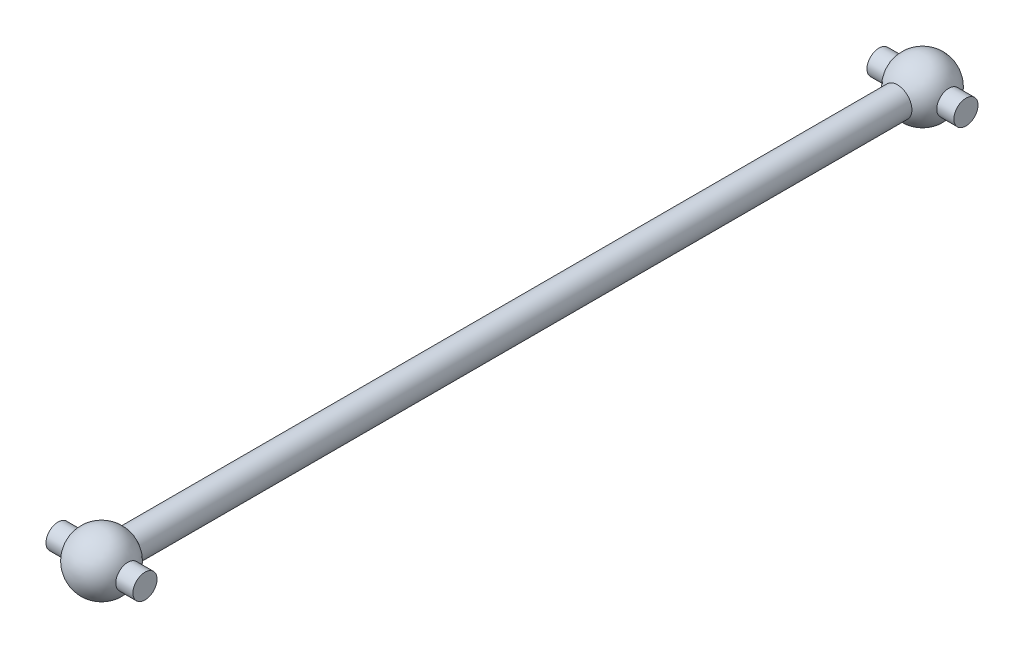
ISO-10303-21;
HEADER;
FILE_DESCRIPTION(('STEP AP214'),'2;1');
FILE_NAME('part.step','',(''),(''),'','','');
FILE_SCHEMA(('AUTOMOTIVE_DESIGN { 1 0 10303 214 1 1 1 1 }'));
ENDSEC;
DATA;
#1=APPLICATION_CONTEXT('core data for automotive mechanical design processes');
#2=APPLICATION_PROTOCOL_DEFINITION('international standard','automotive_design',2000,#1);
#3=PRODUCT_CONTEXT('',#1,'mechanical');
#4=PRODUCT('Part','Part','',(#3));
#5=PRODUCT_RELATED_PRODUCT_CATEGORY('part','',(#4));
#6=PRODUCT_DEFINITION_FORMATION('','',#4);
#7=PRODUCT_DEFINITION_CONTEXT('part definition',#1,'design');
#8=PRODUCT_DEFINITION('design','',#6,#7);
#9=PRODUCT_DEFINITION_SHAPE('','',#8);
#10=(LENGTH_UNIT() NAMED_UNIT(*) SI_UNIT(.MILLI.,.METRE.));
#11=(NAMED_UNIT(*) PLANE_ANGLE_UNIT() SI_UNIT($,.RADIAN.));
#12=(NAMED_UNIT(*) SI_UNIT($,.STERADIAN.) SOLID_ANGLE_UNIT());
#13=UNCERTAINTY_MEASURE_WITH_UNIT(LENGTH_MEASURE(1.E-05),#10,'distance_accuracy_value','');
#14=(GEOMETRIC_REPRESENTATION_CONTEXT(3) GLOBAL_UNCERTAINTY_ASSIGNED_CONTEXT((#13)) GLOBAL_UNIT_ASSIGNED_CONTEXT((#10,
#11,#12)) REPRESENTATION_CONTEXT('',''));
#15=CARTESIAN_POINT('',(0.,0.,0.));
#16=DIRECTION('',(0.,0.,1.));
#17=DIRECTION('',(1.,0.,0.));
#18=AXIS2_PLACEMENT_3D('',#15,#16,#17);
#19=CARTESIAN_POINT('',(0.,0.,-42.5));
#20=DIRECTION('',(0.,1.,0.));
#21=DIRECTION('',(0.,0.,1.));
#22=AXIS2_PLACEMENT_3D('',#19,#20,#21);
#23=SPHERICAL_SURFACE('',#22,3.);
#24=CARTESIAN_POINT('',(-2.72717802865893,0.,-42.5));
#25=DIRECTION('',(1.,0.,0.));
#26=DIRECTION('',(0.,0.,-1.));
#27=AXIS2_PLACEMENT_3D('',#24,#25,#26);
#28=CIRCLE('',#27,1.25);
#29=CARTESIAN_POINT('',(-2.72717802865893,0.,-43.75));
#30=VERTEX_POINT('',#29);
#31=EDGE_CURVE('E51',#30,#30,#28,.T.);
#32=ORIENTED_EDGE('',*,*,#31,.T.);
#33=EDGE_LOOP('',(#32));
#34=FACE_BOUND('',#33,.T.);
#35=CARTESIAN_POINT('',(0.,0.,-39.9019237886467));
#36=DIRECTION('',(0.,0.,-0.999999999999999));
#37=DIRECTION('',(-1.,0.,0.));
#38=AXIS2_PLACEMENT_3D('',#35,#36,#37);
#39=CIRCLE('',#38,1.5);
#40=CARTESIAN_POINT('',(1.5,0.,-39.9019237886467));
#41=VERTEX_POINT('',#40);
#42=EDGE_CURVE('E10',#41,#41,#39,.T.);
#43=ORIENTED_EDGE('',*,*,#42,.T.);
#44=EDGE_LOOP('',(#43));
#45=FACE_BOUND('',#44,.T.);
#46=CARTESIAN_POINT('',(2.72717802865893,0.,-42.5));
#47=DIRECTION('',(-1.,0.,0.));
#48=DIRECTION('',(0.,0.,1.));
#49=AXIS2_PLACEMENT_3D('',#46,#47,#48);
#50=CIRCLE('',#49,1.25);
#51=CARTESIAN_POINT('',(2.72717802865893,0.,-41.25));
#52=VERTEX_POINT('',#51);
#53=EDGE_CURVE('E39',#52,#52,#50,.T.);
#54=ORIENTED_EDGE('',*,*,#53,.T.);
#55=EDGE_LOOP('',(#54));
#56=FACE_BOUND('',#55,.T.);
#57=ADVANCED_FACE('F35',(#34,#45,#56),#23,.T.);
#58=CARTESIAN_POINT('',(0.,0.,-42.5));
#59=DIRECTION('',(0.,0.,1.));
#60=DIRECTION('',(1.,0.,0.));
#61=AXIS2_PLACEMENT_3D('',#58,#59,#60);
#62=CYLINDRICAL_SURFACE('',#61,1.5);
#63=CARTESIAN_POINT('',(0.,0.,39.9019237886467));
#64=DIRECTION('',(0.,0.,0.999999999999999));
#65=DIRECTION('',(1.,0.,0.));
#66=AXIS2_PLACEMENT_3D('',#63,#64,#65);
#67=CIRCLE('',#66,1.5);
#68=CARTESIAN_POINT('',(1.5,0.,39.9019237886467));
#69=VERTEX_POINT('',#68);
#70=EDGE_CURVE('E71',#69,#69,#67,.T.);
#71=CARTESIAN_POINT('',(1.5,0.,-39.9019237886467));
#72=CARTESIAN_POINT('',(1.5,0.,-39.0706337097165));
#73=CARTESIAN_POINT('',(1.5,0.,-38.2393436307864));
#74=CARTESIAN_POINT('',(1.5,0.,-36.5767634729261));
#75=CARTESIAN_POINT('',(1.5,0.,-35.745473393996));
#76=CARTESIAN_POINT('',(1.5,0.,-34.0828932361357));
#77=CARTESIAN_POINT('',(1.5,0.,-33.2516031572056));
#78=CARTESIAN_POINT('',(1.5,0.,-31.5890229993453));
#79=CARTESIAN_POINT('',(1.5,0.,-30.7577329204152));
#80=CARTESIAN_POINT('',(1.5,0.,-29.0951527625549));
#81=CARTESIAN_POINT('',(1.5,0.,-28.2638626836247));
#82=CARTESIAN_POINT('',(1.5,0.,-26.6012825257645));
#83=CARTESIAN_POINT('',(1.5,0.,-25.7699924468343));
#84=CARTESIAN_POINT('',(1.5,0.,-24.107412288974));
#85=CARTESIAN_POINT('',(1.5,0.,-23.2761222100439));
#86=CARTESIAN_POINT('',(1.5,0.,-21.6135420521836));
#87=CARTESIAN_POINT('',(1.5,0.,-20.7822519732535));
#88=CARTESIAN_POINT('',(1.5,0.,-19.1196718153932));
#89=CARTESIAN_POINT('',(1.5,0.,-18.2883817364631));
#90=CARTESIAN_POINT('',(1.5,0.,-16.6258015786028));
#91=CARTESIAN_POINT('',(1.5,0.,-15.7945114996726));
#92=CARTESIAN_POINT('',(1.5,0.,-14.1319313418124));
#93=CARTESIAN_POINT('',(1.5,0.,-13.3006412628822));
#94=CARTESIAN_POINT('',(1.5,0.,-11.6380611050219));
#95=CARTESIAN_POINT('',(1.5,0.,-10.8067710260918));
#96=CARTESIAN_POINT('',(1.5,0.,-9.14419086823153));
#97=CARTESIAN_POINT('',(1.5,0.,-8.31290078930139));
#98=CARTESIAN_POINT('',(1.5,0.,-6.65032063144112));
#99=CARTESIAN_POINT('',(1.5,0.,-5.81903055251098));
#100=CARTESIAN_POINT('',(1.5,0.,-4.1564503946507));
#101=CARTESIAN_POINT('',(1.5,0.,-3.32516031572055));
#102=CARTESIAN_POINT('',(1.5,0.,-1.66258015786027));
#103=CARTESIAN_POINT('',(1.5,0.,-0.831290078930131));
#104=CARTESIAN_POINT('',(1.5,0.,0.831290078930145));
#105=CARTESIAN_POINT('',(1.5,0.,1.66258015786028));
#106=CARTESIAN_POINT('',(1.5,0.,3.32516031572056));
#107=CARTESIAN_POINT('',(1.5,0.,4.1564503946507));
#108=CARTESIAN_POINT('',(1.5,0.,5.81903055251098));
#109=CARTESIAN_POINT('',(1.5,0.,6.65032063144112));
#110=CARTESIAN_POINT('',(1.5,0.,8.31290078930139));
#111=CARTESIAN_POINT('',(1.5,0.,9.14419086823153));
#112=CARTESIAN_POINT('',(1.5,0.,10.8067710260918));
#113=CARTESIAN_POINT('',(1.5,0.,11.638061105022));
#114=CARTESIAN_POINT('',(1.5,0.,13.3006412628822));
#115=CARTESIAN_POINT('',(1.5,0.,14.1319313418124));
#116=CARTESIAN_POINT('',(1.5,0.,15.7945114996727));
#117=CARTESIAN_POINT('',(1.5,0.,16.6258015786028));
#118=CARTESIAN_POINT('',(1.5,0.,18.2883817364631));
#119=CARTESIAN_POINT('',(1.5,0.,19.1196718153932));
#120=CARTESIAN_POINT('',(1.5,0.,20.7822519732535));
#121=CARTESIAN_POINT('',(1.5,0.,21.6135420521836));
#122=CARTESIAN_POINT('',(1.5,0.,23.2761222100439));
#123=CARTESIAN_POINT('',(1.5,0.,24.107412288974));
#124=CARTESIAN_POINT('',(1.5,0.,25.7699924468343));
#125=CARTESIAN_POINT('',(1.5,0.,26.6012825257645));
#126=CARTESIAN_POINT('',(1.5,0.,28.2638626836247));
#127=CARTESIAN_POINT('',(1.5,0.,29.0951527625549));
#128=CARTESIAN_POINT('',(1.5,0.,30.7577329204152));
#129=CARTESIAN_POINT('',(1.5,0.,31.5890229993453));
#130=CARTESIAN_POINT('',(1.5,0.,33.2516031572056));
#131=CARTESIAN_POINT('',(1.5,0.,34.0828932361357));
#132=CARTESIAN_POINT('',(1.5,0.,35.745473393996));
#133=CARTESIAN_POINT('',(1.5,0.,36.5767634729261));
#134=CARTESIAN_POINT('',(1.5,0.,38.2393436307864));
#135=CARTESIAN_POINT('',(1.5,0.,39.0706337097166));
#136=CARTESIAN_POINT('',(1.5,0.,39.9019237886467));
#137=B_SPLINE_CURVE_WITH_KNOTS('',3,(#71,#72,#73,#74,#75,#76,#77,#78,#79,#80,#81,#82,#83,#84,
#85,#86,#87,#88,#89,#90,#91,#92,#93,#94,#95,#96,#97,#98,#99,#100,#101,#102,#103,#104,#105,#106,
#107,#108,#109,#110,#111,#112,#113,#114,#115,#116,#117,#118,#119,#120,#121,#122,#123,#124,#125,
#126,#127,#128,#129,#130,#131,#132,#133,#134,#135,#136),.UNSPECIFIED.,.F.,.F.,(4,2,2,2,2,2,2,2,
2,2,2,2,2,2,2,2,2,2,2,2,2,2,2,2,2,2,2,2,2,2,2,2,4),(0.,2.49387023679042,4.98774047358083,
7.48161071037125,9.97548094716167,12.4693511839521,14.9632214207425,17.4570916575329,
19.9509618943233,22.4448321311138,24.9387023679042,27.4325726046946,29.926442841485,
32.4203130782754,34.9141833150658,37.4080535518563,39.9019237886467,42.3957940254371,
44.8896642622275,47.3835344990179,49.8774047358084,52.3712749725988,54.8651452093892,
57.3590154461796,59.85288568297,62.3467559197604,64.8406261565509,67.3344963933413,
69.8283666301317,72.3222368669221,74.8161071037125,77.309977340503,79.8038475772934),.UNSPECIFIED.);
#138=EDGE_CURVE('BSEAM37',#41,#69,#137,.T.);
#139=ORIENTED_EDGE('',*,*,#42,.F.);
#140=ORIENTED_EDGE('',*,*,#70,.F.);
#141=ORIENTED_EDGE('',*,*,#138,.T.);
#142=ORIENTED_EDGE('',*,*,#138,.F.);
#143=EDGE_LOOP('',(#139,#141,#140,#142));
#144=FACE_BOUND('',#143,.T.);
#145=ADVANCED_FACE('F37',(#144),#62,.T.);
#146=CARTESIAN_POINT('',(0.,0.,42.5));
#147=DIRECTION('',(0.,1.,0.));
#148=DIRECTION('',(0.,0.,-1.));
#149=AXIS2_PLACEMENT_3D('',#146,#147,#148);
#150=SPHERICAL_SURFACE('',#149,3.);
#151=CARTESIAN_POINT('',(2.72717802865893,0.,42.5));
#152=DIRECTION('',(-1.,0.,0.));
#153=DIRECTION('',(0.,0.,1.));
#154=AXIS2_PLACEMENT_3D('',#151,#152,#153);
#155=CIRCLE('',#154,1.25);
#156=CARTESIAN_POINT('',(2.72717802865893,0.,43.75));
#157=VERTEX_POINT('',#156);
#158=EDGE_CURVE('E43',#157,#157,#155,.F.);
#159=ORIENTED_EDGE('',*,*,#158,.F.);
#160=EDGE_LOOP('',(#159));
#161=FACE_BOUND('',#160,.T.);
#162=CARTESIAN_POINT('',(-2.72717802865893,0.,42.5));
#163=DIRECTION('',(1.,0.,0.));
#164=DIRECTION('',(0.,0.,-1.));
#165=AXIS2_PLACEMENT_3D('',#162,#163,#164);
#166=CIRCLE('',#165,1.25);
#167=CARTESIAN_POINT('',(-2.72717802865893,0.,41.25));
#168=VERTEX_POINT('',#167);
#169=EDGE_CURVE('E48',#168,#168,#166,.F.);
#170=ORIENTED_EDGE('',*,*,#169,.F.);
#171=EDGE_LOOP('',(#170));
#172=FACE_BOUND('',#171,.T.);
#173=ORIENTED_EDGE('',*,*,#70,.T.);
#174=EDGE_LOOP('',(#173));
#175=FACE_BOUND('',#174,.T.);
#176=ADVANCED_FACE('F79',(#161,#172,#175),#150,.T.);
#177=CARTESIAN_POINT('',(-4.5,0.,42.5));
#178=DIRECTION('',(1.,0.,0.));
#179=DIRECTION('',(0.,0.,-1.));
#180=AXIS2_PLACEMENT_3D('',#177,#178,#179);
#181=PLANE('',#180);
#182=CARTESIAN_POINT('',(-4.5,0.,42.5));
#183=DIRECTION('',(1.,0.,0.));
#184=DIRECTION('',(0.,0.,-1.));
#185=AXIS2_PLACEMENT_3D('',#182,#183,#184);
#186=CIRCLE('',#185,1.25);
#187=CARTESIAN_POINT('',(-4.5,0.,41.25));
#188=VERTEX_POINT('',#187);
#189=EDGE_CURVE('E68',#188,#188,#186,.T.);
#190=ORIENTED_EDGE('',*,*,#189,.F.);
#191=EDGE_LOOP('',(#190));
#192=FACE_BOUND('',#191,.T.);
#193=ADVANCED_FACE('F82',(#192),#181,.F.);
#194=CARTESIAN_POINT('',(-4.5,0.,42.5));
#195=DIRECTION('',(1.,0.,0.));
#196=DIRECTION('',(0.,0.,-1.));
#197=AXIS2_PLACEMENT_3D('',#194,#195,#196);
#198=CYLINDRICAL_SURFACE('',#197,1.25);
#199=ORIENTED_EDGE('',*,*,#169,.T.);
#200=EDGE_LOOP('',(#199));
#201=FACE_BOUND('',#200,.T.);
#202=ORIENTED_EDGE('',*,*,#189,.T.);
#203=EDGE_LOOP('',(#202));
#204=FACE_BOUND('',#203,.T.);
#205=ADVANCED_FACE('F76',(#201,#204),#198,.T.);
#206=ORIENTED_EDGE('',*,*,#158,.T.);
#207=EDGE_LOOP('',(#206));
#208=FACE_BOUND('',#207,.T.);
#209=CARTESIAN_POINT('',(4.5,0.,42.5));
#210=DIRECTION('',(1.,0.,0.));
#211=DIRECTION('',(0.,0.,-1.));
#212=AXIS2_PLACEMENT_3D('',#209,#210,#211);
#213=CIRCLE('',#212,1.25);
#214=CARTESIAN_POINT('',(4.5,0.,41.25));
#215=VERTEX_POINT('',#214);
#216=EDGE_CURVE('E57',#215,#215,#213,.T.);
#217=ORIENTED_EDGE('',*,*,#216,.F.);
#218=EDGE_LOOP('',(#217));
#219=FACE_BOUND('',#218,.T.);
#220=ADVANCED_FACE('F102',(#208,#219),#198,.T.);
#221=CARTESIAN_POINT('',(4.5,0.,42.5));
#222=DIRECTION('',(1.,0.,0.));
#223=DIRECTION('',(0.,0.,-1.));
#224=AXIS2_PLACEMENT_3D('',#221,#222,#223);
#225=PLANE('',#224);
#226=ORIENTED_EDGE('',*,*,#216,.T.);
#227=EDGE_LOOP('',(#226));
#228=FACE_BOUND('',#227,.T.);
#229=ADVANCED_FACE('F98',(#228),#225,.T.);
#230=CARTESIAN_POINT('',(-4.5,0.,-42.5));
#231=DIRECTION('',(1.,0.,0.));
#232=DIRECTION('',(0.,0.,1.));
#233=AXIS2_PLACEMENT_3D('',#230,#231,#232);
#234=PLANE('',#233);
#235=CARTESIAN_POINT('',(-4.5,0.,-42.5));
#236=DIRECTION('',(-1.,0.,0.));
#237=DIRECTION('',(0.,0.,1.));
#238=AXIS2_PLACEMENT_3D('',#235,#236,#237);
#239=CIRCLE('',#238,1.25);
#240=CARTESIAN_POINT('',(-4.5,0.,-41.25));
#241=VERTEX_POINT('',#240);
#242=EDGE_CURVE('E53',#241,#241,#239,.T.);
#243=ORIENTED_EDGE('',*,*,#242,.T.);
#244=EDGE_LOOP('',(#243));
#245=FACE_BOUND('',#244,.T.);
#246=ADVANCED_FACE('F101',(#245),#234,.F.);
#247=CARTESIAN_POINT('',(-4.5,0.,-42.5));
#248=DIRECTION('',(1.,0.,0.));
#249=DIRECTION('',(0.,0.,-1.));
#250=AXIS2_PLACEMENT_3D('',#247,#248,#249);
#251=CYLINDRICAL_SURFACE('',#250,1.25);
#252=ORIENTED_EDGE('',*,*,#31,.F.);
#253=EDGE_LOOP('',(#252));
#254=FACE_BOUND('',#253,.T.);
#255=ORIENTED_EDGE('',*,*,#242,.F.);
#256=EDGE_LOOP('',(#255));
#257=FACE_BOUND('',#256,.T.);
#258=ADVANCED_FACE('F96',(#254,#257),#251,.T.);
#259=ORIENTED_EDGE('',*,*,#53,.F.);
#260=EDGE_LOOP('',(#259));
#261=FACE_BOUND('',#260,.T.);
#262=CARTESIAN_POINT('',(4.5,0.,-42.5));
#263=DIRECTION('',(-1.,0.,0.));
#264=DIRECTION('',(0.,0.,1.));
#265=AXIS2_PLACEMENT_3D('',#262,#263,#264);
#266=CIRCLE('',#265,1.25);
#267=CARTESIAN_POINT('',(4.5,0.,-41.25));
#268=VERTEX_POINT('',#267);
#269=EDGE_CURVE('E59',#268,#268,#266,.T.);
#270=ORIENTED_EDGE('',*,*,#269,.T.);
#271=EDGE_LOOP('',(#270));
#272=FACE_BOUND('',#271,.T.);
#273=ADVANCED_FACE('F134',(#261,#272),#251,.T.);
#274=CARTESIAN_POINT('',(4.5,0.,-42.5));
#275=DIRECTION('',(1.,0.,0.));
#276=DIRECTION('',(0.,0.,1.));
#277=AXIS2_PLACEMENT_3D('',#274,#275,#276);
#278=PLANE('',#277);
#279=ORIENTED_EDGE('',*,*,#269,.F.);
#280=EDGE_LOOP('',(#279));
#281=FACE_BOUND('',#280,.T.);
#282=ADVANCED_FACE('F141',(#281),#278,.T.);
#283=CLOSED_SHELL('',(#57,#145,#176,#193,#205,#220,#229,#246,#258,#273,#282));
#284=MANIFOLD_SOLID_BREP('B2',#283);
#285=ADVANCED_BREP_SHAPE_REPRESENTATION('',(#18,#284),#14);
#286=SHAPE_DEFINITION_REPRESENTATION(#9,#285);
ENDSEC;
END-ISO-10303-21;
